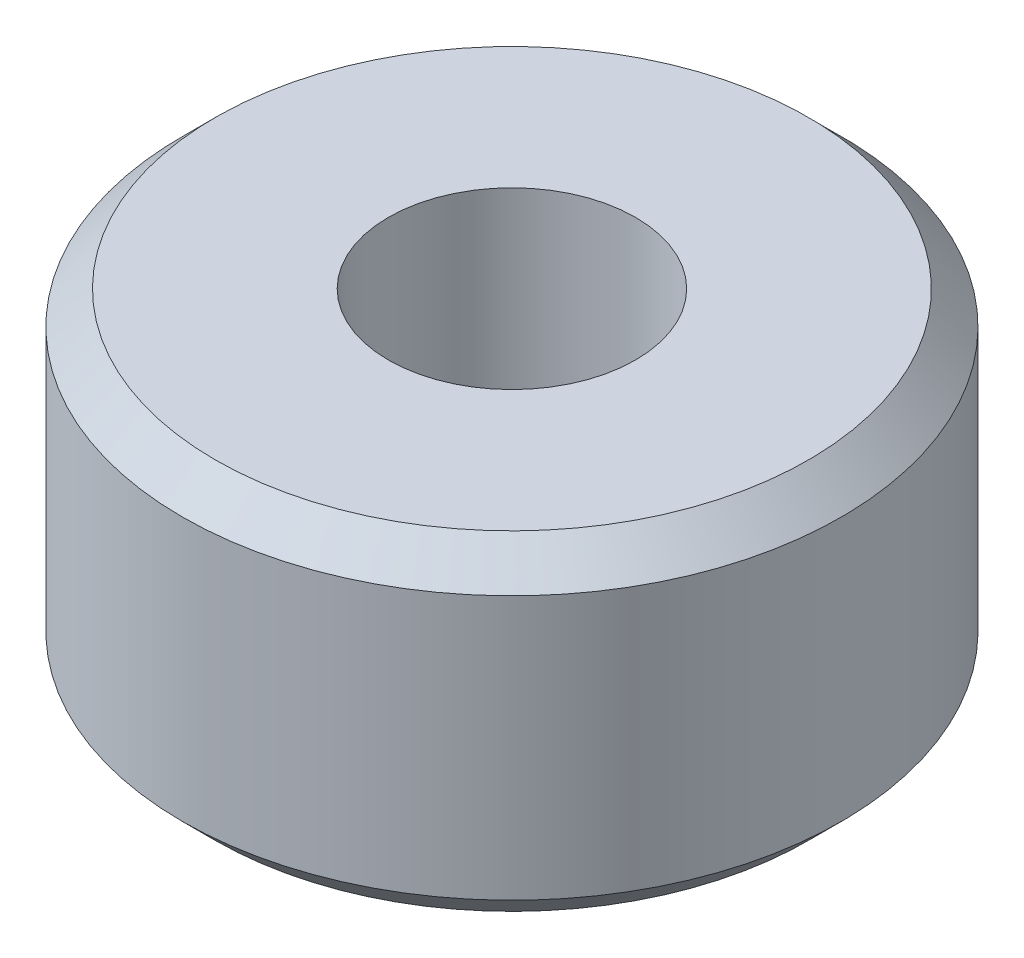
ISO-10303-21;
HEADER;
FILE_DESCRIPTION(('STEP AP214'),'2;1');
FILE_NAME('part.step','',(''),(''),'','','');
FILE_SCHEMA(('AUTOMOTIVE_DESIGN { 1 0 10303 214 1 1 1 1 }'));
ENDSEC;
DATA;
#1=APPLICATION_CONTEXT('core data for automotive mechanical design processes');
#2=APPLICATION_PROTOCOL_DEFINITION('international standard','automotive_design',2000,#1);
#3=PRODUCT_CONTEXT('',#1,'mechanical');
#4=PRODUCT('Part','Part','',(#3));
#5=PRODUCT_RELATED_PRODUCT_CATEGORY('part','',(#4));
#6=PRODUCT_DEFINITION_FORMATION('','',#4);
#7=PRODUCT_DEFINITION_CONTEXT('part definition',#1,'design');
#8=PRODUCT_DEFINITION('design','',#6,#7);
#9=PRODUCT_DEFINITION_SHAPE('','',#8);
#10=(LENGTH_UNIT() NAMED_UNIT(*) SI_UNIT(.MILLI.,.METRE.));
#11=(NAMED_UNIT(*) PLANE_ANGLE_UNIT() SI_UNIT($,.RADIAN.));
#12=(NAMED_UNIT(*) SI_UNIT($,.STERADIAN.) SOLID_ANGLE_UNIT());
#13=UNCERTAINTY_MEASURE_WITH_UNIT(LENGTH_MEASURE(1.E-05),#10,'distance_accuracy_value','');
#14=(GEOMETRIC_REPRESENTATION_CONTEXT(3) GLOBAL_UNCERTAINTY_ASSIGNED_CONTEXT((#13)) GLOBAL_UNIT_ASSIGNED_CONTEXT((#10,
#11,#12)) REPRESENTATION_CONTEXT('',''));
#15=CARTESIAN_POINT('',(0.,0.,0.));
#16=DIRECTION('',(0.,0.,1.));
#17=DIRECTION('',(1.,0.,0.));
#18=AXIS2_PLACEMENT_3D('',#15,#16,#17);
#19=CARTESIAN_POINT('',(0.,4.,0.));
#20=DIRECTION('',(0.,1.,0.));
#21=DIRECTION('',(0.,0.,1.));
#22=AXIS2_PLACEMENT_3D('',#19,#20,#21);
#23=PLANE('',#22);
#24=CARTESIAN_POINT('',(0.,4.,0.));
#25=DIRECTION('',(0.,1.,0.));
#26=DIRECTION('',(0.,0.,1.));
#27=AXIS2_PLACEMENT_3D('',#24,#25,#26);
#28=CIRCLE('',#27,3.6);
#29=CARTESIAN_POINT('',(0.,4.,3.6));
#30=VERTEX_POINT('',#29);
#31=EDGE_CURVE('E10',#30,#30,#28,.T.);
#32=ORIENTED_EDGE('',*,*,#31,.T.);
#33=EDGE_LOOP('',(#32));
#34=FACE_BOUND('',#33,.T.);
#35=CARTESIAN_POINT('',(0.,4.,0.));
#36=DIRECTION('',(0.,1.,0.));
#37=DIRECTION('',(0.,0.,1.));
#38=AXIS2_PLACEMENT_3D('',#35,#36,#37);
#39=CIRCLE('',#38,1.5);
#40=CARTESIAN_POINT('',(0.,4.,1.5));
#41=VERTEX_POINT('',#40);
#42=EDGE_CURVE('E52',#41,#41,#39,.T.);
#43=ORIENTED_EDGE('',*,*,#42,.F.);
#44=EDGE_LOOP('',(#43));
#45=FACE_BOUND('',#44,.T.);
#46=ADVANCED_FACE('F32',(#34,#45),#23,.T.);
#47=CARTESIAN_POINT('',(0.,0.,0.));
#48=DIRECTION('',(0.,1.,0.));
#49=DIRECTION('',(0.,0.,1.));
#50=AXIS2_PLACEMENT_3D('',#47,#48,#49);
#51=PLANE('',#50);
#52=CARTESIAN_POINT('',(0.,0.,0.));
#53=DIRECTION('',(0.,1.,0.));
#54=DIRECTION('',(0.,0.,1.));
#55=AXIS2_PLACEMENT_3D('',#52,#53,#54);
#56=CIRCLE('',#55,3.6);
#57=CARTESIAN_POINT('',(0.,0.,3.6));
#58=VERTEX_POINT('',#57);
#59=EDGE_CURVE('E39',#58,#58,#56,.F.);
#60=ORIENTED_EDGE('',*,*,#59,.T.);
#61=EDGE_LOOP('',(#60));
#62=FACE_BOUND('',#61,.T.);
#63=CARTESIAN_POINT('',(0.,0.,0.));
#64=DIRECTION('',(0.,1.,0.));
#65=DIRECTION('',(0.,0.,1.));
#66=AXIS2_PLACEMENT_3D('',#63,#64,#65);
#67=CIRCLE('',#66,1.5);
#68=CARTESIAN_POINT('',(0.,0.,1.5));
#69=VERTEX_POINT('',#68);
#70=EDGE_CURVE('E53',#69,#69,#67,.T.);
#71=ORIENTED_EDGE('',*,*,#70,.T.);
#72=EDGE_LOOP('',(#71));
#73=FACE_BOUND('',#72,.T.);
#74=ADVANCED_FACE('F63',(#62,#73),#51,.F.);
#75=CARTESIAN_POINT('',(0.,4.,0.));
#76=DIRECTION('',(0.,-1.,0.));
#77=DIRECTION('',(0.,0.,-1.));
#78=AXIS2_PLACEMENT_3D('',#75,#76,#77);
#79=CYLINDRICAL_SURFACE('',#78,4.);
#80=CARTESIAN_POINT('',(0.,0.400000000000002,0.));
#81=DIRECTION('',(0.,1.,0.));
#82=DIRECTION('',(0.,0.,1.));
#83=AXIS2_PLACEMENT_3D('',#80,#81,#82);
#84=CIRCLE('',#83,4.);
#85=CARTESIAN_POINT('',(0.,0.400000000000002,4.));
#86=VERTEX_POINT('',#85);
#87=EDGE_CURVE('E43',#86,#86,#84,.T.);
#88=ORIENTED_EDGE('',*,*,#87,.T.);
#89=EDGE_LOOP('',(#88));
#90=FACE_BOUND('',#89,.T.);
#91=CARTESIAN_POINT('',(0.,3.6,0.));
#92=DIRECTION('',(0.,1.,0.));
#93=DIRECTION('',(0.,0.,1.));
#94=AXIS2_PLACEMENT_3D('',#91,#92,#93);
#95=CIRCLE('',#94,4.);
#96=CARTESIAN_POINT('',(0.,3.6,4.));
#97=VERTEX_POINT('',#96);
#98=EDGE_CURVE('E47',#97,#97,#95,.F.);
#99=ORIENTED_EDGE('',*,*,#98,.T.);
#100=EDGE_LOOP('',(#99));
#101=FACE_BOUND('',#100,.T.);
#102=ADVANCED_FACE('F68',(#90,#101),#79,.T.);
#103=CARTESIAN_POINT('',(0.,4.,0.));
#104=DIRECTION('',(0.,-1.,0.));
#105=DIRECTION('',(0.,0.,-1.));
#106=AXIS2_PLACEMENT_3D('',#103,#104,#105);
#107=CYLINDRICAL_SURFACE('',#106,1.5);
#108=ORIENTED_EDGE('',*,*,#42,.T.);
#109=EDGE_LOOP('',(#108));
#110=FACE_BOUND('',#109,.T.);
#111=ORIENTED_EDGE('',*,*,#70,.F.);
#112=EDGE_LOOP('',(#111));
#113=FACE_BOUND('',#112,.T.);
#114=ADVANCED_FACE('F59',(#110,#113),#107,.F.);
#115=CARTESIAN_POINT('',(0.,0.400000000000002,0.));
#116=DIRECTION('',(0.,1.,0.));
#117=DIRECTION('',(0.,0.,1.));
#118=AXIS2_PLACEMENT_3D('',#115,#116,#117);
#119=CONICAL_SURFACE('',#118,4.,0.785398163397449);
#120=ORIENTED_EDGE('',*,*,#59,.F.);
#121=EDGE_LOOP('',(#120));
#122=FACE_BOUND('',#121,.T.);
#123=ORIENTED_EDGE('',*,*,#87,.F.);
#124=EDGE_LOOP('',(#123));
#125=FACE_BOUND('',#124,.T.);
#126=ADVANCED_FACE('F74',(#122,#125),#119,.T.);
#127=CARTESIAN_POINT('',(0.,4.,0.));
#128=DIRECTION('',(0.,-1.,0.));
#129=DIRECTION('',(0.,0.,-1.));
#130=AXIS2_PLACEMENT_3D('',#127,#128,#129);
#131=CONICAL_SURFACE('',#130,3.6,0.785398163397446);
#132=ORIENTED_EDGE('',*,*,#98,.F.);
#133=EDGE_LOOP('',(#132));
#134=FACE_BOUND('',#133,.T.);
#135=ORIENTED_EDGE('',*,*,#31,.F.);
#136=EDGE_LOOP('',(#135));
#137=FACE_BOUND('',#136,.T.);
#138=ADVANCED_FACE('F34',(#134,#137),#131,.T.);
#139=CLOSED_SHELL('',(#46,#74,#102,#114,#126,#138));
#140=MANIFOLD_SOLID_BREP('B2',#139);
#141=ADVANCED_BREP_SHAPE_REPRESENTATION('',(#18,#140),#14);
#142=SHAPE_DEFINITION_REPRESENTATION(#9,#141);
ENDSEC;
END-ISO-10303-21;
